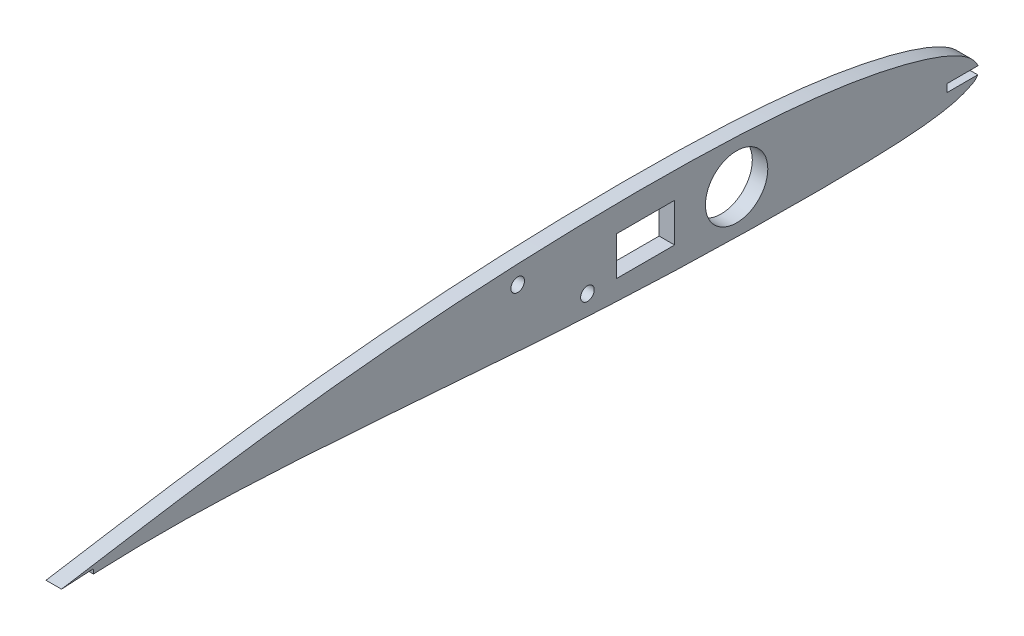
ISO-10303-21;
HEADER;
FILE_DESCRIPTION(('STEP AP214'),'2;1');
FILE_NAME('part.step','',(''),(''),'','','');
FILE_SCHEMA(('AUTOMOTIVE_DESIGN { 1 0 10303 214 1 1 1 1 }'));
ENDSEC;
DATA;
#1=APPLICATION_CONTEXT('core data for automotive mechanical design processes');
#2=APPLICATION_PROTOCOL_DEFINITION('international standard','automotive_design',2000,#1);
#3=PRODUCT_CONTEXT('',#1,'mechanical');
#4=PRODUCT('Part','Part','',(#3));
#5=PRODUCT_RELATED_PRODUCT_CATEGORY('part','',(#4));
#6=PRODUCT_DEFINITION_FORMATION('','',#4);
#7=PRODUCT_DEFINITION_CONTEXT('part definition',#1,'design');
#8=PRODUCT_DEFINITION('design','',#6,#7);
#9=PRODUCT_DEFINITION_SHAPE('','',#8);
#10=(LENGTH_UNIT() NAMED_UNIT(*) SI_UNIT(.MILLI.,.METRE.));
#11=(NAMED_UNIT(*) PLANE_ANGLE_UNIT() SI_UNIT($,.RADIAN.));
#12=(NAMED_UNIT(*) SI_UNIT($,.STERADIAN.) SOLID_ANGLE_UNIT());
#13=UNCERTAINTY_MEASURE_WITH_UNIT(LENGTH_MEASURE(1.E-05),#10,'distance_accuracy_value','');
#14=(GEOMETRIC_REPRESENTATION_CONTEXT(3) GLOBAL_UNCERTAINTY_ASSIGNED_CONTEXT((#13)) GLOBAL_UNIT_ASSIGNED_CONTEXT((#10,
#11,#12)) REPRESENTATION_CONTEXT('',''));
#15=CARTESIAN_POINT('',(0.,0.,0.));
#16=DIRECTION('',(0.,0.,1.));
#17=DIRECTION('',(1.,0.,0.));
#18=AXIS2_PLACEMENT_3D('',#15,#16,#17);
#19=CARTESIAN_POINT('',(4.,0.,250.));
#20=CARTESIAN_POINT('',(4.,-0.0080427959719715,250.000228293678));
#21=CARTESIAN_POINT('',(4.,0.172375657967406,248.284955515532));
#22=CARTESIAN_POINT('',(4.,0.308690014795419,246.518112419387));
#23=CARTESIAN_POINT('',(4.,0.685693593852336,242.189387343398));
#24=CARTESIAN_POINT('',(4.,1.07410152891603,236.806461263496));
#25=CARTESIAN_POINT('',(4.,1.49731723995003,229.680385951639));
#26=CARTESIAN_POINT('',(4.,1.8232186026768,221.18415869828));
#27=CARTESIAN_POINT('',(4.,1.96762610068065,211.337618207726));
#28=CARTESIAN_POINT('',(4.,1.83322105638369,200.371188527109));
#29=CARTESIAN_POINT('',(4.,1.38960528984164,188.499913622482));
#30=CARTESIAN_POINT('',(4.,0.706014078000893,175.953687417433));
#31=CARTESIAN_POINT('',(4.,-0.160208641561513,162.931424917666));
#32=CARTESIAN_POINT('',(4.,-1.14801632724376,149.615771743617));
#33=CARTESIAN_POINT('',(4.,-2.19092490983926,136.176354994724));
#34=CARTESIAN_POINT('',(4.,-3.21958397917046,122.767140548026));
#35=CARTESIAN_POINT('',(4.,-4.15274312671142,109.520053587455));
#36=CARTESIAN_POINT('',(4.,-4.93856436487493,96.5460959745437));
#37=CARTESIAN_POINT('',(4.,-5.53683070268675,83.9408193016427));
#38=CARTESIAN_POINT('',(4.,-5.94764820461108,71.8018392906514));
#39=CARTESIAN_POINT('',(4.,-6.21845093878312,60.2452560030716));
#40=CARTESIAN_POINT('',(4.,-6.35536975583973,49.3987328907547));
#41=CARTESIAN_POINT('',(4.,-6.38138796281789,39.3972261942655));
#42=CARTESIAN_POINT('',(4.,-6.26504923032313,30.3619348419668));
#43=CARTESIAN_POINT('',(4.,-6.01216491688521,22.4121811031587));
#44=CARTESIAN_POINT('',(4.,-5.59743390072595,15.6262272306516));
#45=CARTESIAN_POINT('',(4.,-4.92870657935606,10.0719075109048));
#46=CARTESIAN_POINT('',(4.,-4.04044698146404,5.69769261214423));
#47=CARTESIAN_POINT('',(4.,-2.8657529844069,2.62532063874475));
#48=CARTESIAN_POINT('',(4.,-1.7115284699546,0.494884225045661));
#49=CARTESIAN_POINT('',(4.,-0.410454230626488,-0.0213125491030087));
#50=CARTESIAN_POINT('',(4.,0.792659826704065,0.0311691995850224));
#51=CARTESIAN_POINT('',(4.,2.30568433693192,0.812599241892923));
#52=CARTESIAN_POINT('',(4.,4.23835242447377,2.72886351673443));
#53=CARTESIAN_POINT('',(4.,6.11817212106947,5.76990724125498));
#54=CARTESIAN_POINT('',(4.,7.91359420170391,9.88094280419771));
#55=CARTESIAN_POINT('',(4.,9.64131817838287,15.0749304677094));
#56=CARTESIAN_POINT('',(4.,11.2838964878058,21.2987522216172));
#57=CARTESIAN_POINT('',(4.,12.7883817585812,28.4971721202648));
#58=CARTESIAN_POINT('',(4.,14.0978349081275,36.6073734062479));
#59=CARTESIAN_POINT('',(4.,15.1594290171638,45.573028440303));
#60=CARTESIAN_POINT('',(4.,15.9609039979753,55.3329100744701));
#61=CARTESIAN_POINT('',(4.,16.4940697383882,65.8165364983871));
#62=CARTESIAN_POINT('',(4.,16.7919897051422,76.9313762604552));
#63=CARTESIAN_POINT('',(4.,16.864754130909,88.5669490281142));
#64=CARTESIAN_POINT('',(4.,16.7267152914356,100.596999885542));
#65=CARTESIAN_POINT('',(4.,16.3833850637257,112.888825982424));
#66=CARTESIAN_POINT('',(4.,15.825573666627,125.31161581915));
#67=CARTESIAN_POINT('',(4.,15.0523318700684,137.743791097076));
#68=CARTESIAN_POINT('',(4.,14.0593390742259,150.072384382085));
#69=CARTESIAN_POINT('',(4.,12.8815869860292,162.191375055682));
#70=CARTESIAN_POINT('',(4.,11.5492803460744,173.989074322246));
#71=CARTESIAN_POINT('',(4.,10.1162497290333,185.35236444642));
#72=CARTESIAN_POINT('',(4.,8.63237912523508,196.163081697706));
#73=CARTESIAN_POINT('',(4.,7.13151388385034,206.300441402258));
#74=CARTESIAN_POINT('',(4.,5.73122176805054,215.560350587015));
#75=CARTESIAN_POINT('',(4.,4.29329512716244,223.97715704258));
#76=CARTESIAN_POINT('',(4.,3.1818088737293,231.363413336396));
#77=CARTESIAN_POINT('',(4.,2.09894241729889,237.746440904332));
#78=CARTESIAN_POINT('',(4.,1.2458619166603,242.622069365861));
#79=CARTESIAN_POINT('',(4.,0.552864946230777,246.64452933247));
#80=CARTESIAN_POINT('',(4.,0.246216764640028,248.328398440367));
#81=CARTESIAN_POINT('',(4.,0.00797737724443801,249.999773563223));
#82=CARTESIAN_POINT('',(4.,0.,250.));
#83=B_SPLINE_CURVE_WITH_KNOTS('',3,(#19,#20,#21,#22,#23,#24,#25,#26,#27,#28,#29,#30,#31,#32,#33,
#34,#35,#36,#37,#38,#39,#40,#41,#42,#43,#44,#45,#46,#47,#48,#49,#50,#51,#52,#53,#54,#55,#56,#57,
#58,#59,#60,#61,#62,#63,#64,#65,#66,#67,#68,#69,#70,#71,#72,#73,#74,#75,#76,#77,#78,#79,#80,#81,
#82),.UNSPECIFIED.,.T.,.F.,(4,1,1,1,1,1,1,1,1,1,1,1,1,1,1,1,1,1,1,1,1,1,1,1,1,1,1,1,1,1,1,1,1,1,
1,1,1,1,1,1,1,1,1,1,1,1,1,1,1,1,1,1,1,1,1,1,1,1,1,1,1,4),(0.,0.00158888881614516,
0.00632921783555629,0.0142024564897436,0.0251728077530557,0.0391734833267743,0.0560606311759249,
0.0755789238487882,0.0973636066296903,0.120926258366677,0.145825281006277,0.171670911815127,
0.198108536705041,0.22479018357162,0.25139057978404,0.277643490654311,0.303326750051388,
0.328257458029316,0.352272548115194,0.375156061746876,0.396620664402003,0.416422729294005,
0.434304420097656,0.450054679859308,0.463465465082325,0.474478994238096,0.483169222153171,
0.489678354497499,0.494104066315722,0.496910015324886,0.497289784891853,0.501214273282496,
0.506457950332762,0.51335695674223,0.522168631834455,0.53296596992453,0.545689209241574,
0.56022077890382,0.57643892310517,0.594258689005965,0.613600244568652,0.634342385932902,
0.656331109263004,0.679351893859712,0.703152302846811,0.727478208080039,0.7520707394079,
0.776691163534608,0.801140183976245,0.825214386971546,0.848697423570622,0.871352857669295,
0.892947448931157,0.913230871058069,0.931955467148994,0.94834206907442,0.963693004275676,
0.976235918239566,0.986320058750392,0.993788799349345,0.998424034933867,1.),.UNSPECIFIED.);
#84=DIRECTION('',(-1.,0.,0.));
#85=VECTOR('',#84,1.);
#86=SURFACE_OF_LINEAR_EXTRUSION('',#83,#85);
#87=CARTESIAN_POINT('',(4.,1.5262200158208,228.477241363067));
#88=VERTEX_POINT('',#87);
#89=CARTESIAN_POINT('',(4.,-1.00000653516622,0.266538474913965));
#90=VERTEX_POINT('',#89);
#91=EDGE_CURVE('E60',#88,#90,#83,.T.);
#92=ORIENTED_EDGE('',*,*,#91,.F.);
#93=DIRECTION('',(-1.,0.,0.));
#94=VECTOR('',#93,1.);
#95=CARTESIAN_POINT('',(4.,1.5262200158208,228.477241363067));
#96=LINE('',#95,#94);
#97=CARTESIAN_POINT('',(0.,1.5262200158208,228.477241363067));
#98=VERTEX_POINT('',#97);
#99=EDGE_CURVE('E127',#88,#98,#96,.T.);
#100=ORIENTED_EDGE('',*,*,#99,.T.);
#101=CARTESIAN_POINT('',(0.,0.,250.));
#102=CARTESIAN_POINT('',(0.,-0.0080427959719715,250.000228293678));
#103=CARTESIAN_POINT('',(0.,0.172375657967406,248.284955515532));
#104=CARTESIAN_POINT('',(0.,0.308690014795419,246.518112419387));
#105=CARTESIAN_POINT('',(0.,0.685693593852336,242.189387343398));
#106=CARTESIAN_POINT('',(0.,1.07410152891603,236.806461263496));
#107=CARTESIAN_POINT('',(0.,1.49731723995003,229.680385951639));
#108=CARTESIAN_POINT('',(0.,1.8232186026768,221.18415869828));
#109=CARTESIAN_POINT('',(0.,1.96762610068065,211.337618207726));
#110=CARTESIAN_POINT('',(0.,1.83322105638369,200.371188527109));
#111=CARTESIAN_POINT('',(0.,1.38960528984164,188.499913622482));
#112=CARTESIAN_POINT('',(0.,0.706014078000893,175.953687417433));
#113=CARTESIAN_POINT('',(0.,-0.160208641561513,162.931424917666));
#114=CARTESIAN_POINT('',(0.,-1.14801632724376,149.615771743617));
#115=CARTESIAN_POINT('',(0.,-2.19092490983926,136.176354994724));
#116=CARTESIAN_POINT('',(0.,-3.21958397917046,122.767140548026));
#117=CARTESIAN_POINT('',(0.,-4.15274312671142,109.520053587455));
#118=CARTESIAN_POINT('',(0.,-4.93856436487493,96.5460959745437));
#119=CARTESIAN_POINT('',(0.,-5.53683070268675,83.9408193016427));
#120=CARTESIAN_POINT('',(0.,-5.94764820461108,71.8018392906514));
#121=CARTESIAN_POINT('',(0.,-6.21845093878312,60.2452560030716));
#122=CARTESIAN_POINT('',(0.,-6.35536975583973,49.3987328907547));
#123=CARTESIAN_POINT('',(0.,-6.38138796281789,39.3972261942655));
#124=CARTESIAN_POINT('',(0.,-6.26504923032313,30.3619348419668));
#125=CARTESIAN_POINT('',(0.,-6.01216491688521,22.4121811031587));
#126=CARTESIAN_POINT('',(0.,-5.59743390072595,15.6262272306516));
#127=CARTESIAN_POINT('',(0.,-4.92870657935606,10.0719075109048));
#128=CARTESIAN_POINT('',(0.,-4.04044698146404,5.69769261214423));
#129=CARTESIAN_POINT('',(0.,-2.8657529844069,2.62532063874475));
#130=CARTESIAN_POINT('',(0.,-1.7115284699546,0.494884225045661));
#131=CARTESIAN_POINT('',(0.,-0.410454230626488,-0.0213125491030087));
#132=CARTESIAN_POINT('',(0.,0.792659826704065,0.0311691995850224));
#133=CARTESIAN_POINT('',(0.,2.30568433693192,0.812599241892923));
#134=CARTESIAN_POINT('',(0.,4.23835242447377,2.72886351673443));
#135=CARTESIAN_POINT('',(0.,6.11817212106947,5.76990724125498));
#136=CARTESIAN_POINT('',(0.,7.91359420170391,9.88094280419771));
#137=CARTESIAN_POINT('',(0.,9.64131817838287,15.0749304677094));
#138=CARTESIAN_POINT('',(0.,11.2838964878058,21.2987522216172));
#139=CARTESIAN_POINT('',(0.,12.7883817585812,28.4971721202648));
#140=CARTESIAN_POINT('',(0.,14.0978349081275,36.6073734062479));
#141=CARTESIAN_POINT('',(0.,15.1594290171638,45.573028440303));
#142=CARTESIAN_POINT('',(0.,15.9609039979753,55.3329100744701));
#143=CARTESIAN_POINT('',(0.,16.4940697383882,65.8165364983871));
#144=CARTESIAN_POINT('',(0.,16.7919897051422,76.9313762604552));
#145=CARTESIAN_POINT('',(0.,16.864754130909,88.5669490281142));
#146=CARTESIAN_POINT('',(0.,16.7267152914356,100.596999885542));
#147=CARTESIAN_POINT('',(0.,16.3833850637257,112.888825982424));
#148=CARTESIAN_POINT('',(0.,15.825573666627,125.31161581915));
#149=CARTESIAN_POINT('',(0.,15.0523318700684,137.743791097076));
#150=CARTESIAN_POINT('',(0.,14.0593390742259,150.072384382085));
#151=CARTESIAN_POINT('',(0.,12.8815869860292,162.191375055682));
#152=CARTESIAN_POINT('',(0.,11.5492803460744,173.989074322246));
#153=CARTESIAN_POINT('',(0.,10.1162497290333,185.35236444642));
#154=CARTESIAN_POINT('',(0.,8.63237912523508,196.163081697706));
#155=CARTESIAN_POINT('',(0.,7.13151388385034,206.300441402258));
#156=CARTESIAN_POINT('',(0.,5.73122176805054,215.560350587015));
#157=CARTESIAN_POINT('',(0.,4.29329512716244,223.97715704258));
#158=CARTESIAN_POINT('',(0.,3.1818088737293,231.363413336396));
#159=CARTESIAN_POINT('',(0.,2.09894241729889,237.746440904332));
#160=CARTESIAN_POINT('',(0.,1.2458619166603,242.622069365861));
#161=CARTESIAN_POINT('',(0.,0.552864946230777,246.64452933247));
#162=CARTESIAN_POINT('',(0.,0.246216764640028,248.328398440367));
#163=CARTESIAN_POINT('',(0.,0.00797737724443801,249.999773563223));
#164=CARTESIAN_POINT('',(0.,0.,250.));
#165=B_SPLINE_CURVE_WITH_KNOTS('',3,(#101,#102,#103,#104,#105,#106,#107,#108,#109,#110,#111,
#112,#113,#114,#115,#116,#117,#118,#119,#120,#121,#122,#123,#124,#125,#126,#127,#128,#129,#130,
#131,#132,#133,#134,#135,#136,#137,#138,#139,#140,#141,#142,#143,#144,#145,#146,#147,#148,#149,
#150,#151,#152,#153,#154,#155,#156,#157,#158,#159,#160,#161,#162,#163,#164),.UNSPECIFIED.,.T.,
.F.,(4,1,1,1,1,1,1,1,1,1,1,1,1,1,1,1,1,1,1,1,1,1,1,1,1,1,1,1,1,1,1,1,1,1,1,1,1,1,1,1,1,1,1,1,1,
1,1,1,1,1,1,1,1,1,1,1,1,1,1,1,1,4),(0.,0.00158888881614516,0.00632921783555629,
0.0142024564897436,0.0251728077530557,0.0391734833267743,0.0560606311759249,0.0755789238487882,
0.0973636066296903,0.120926258366677,0.145825281006277,0.171670911815127,0.198108536705041,
0.22479018357162,0.25139057978404,0.277643490654311,0.303326750051388,0.328257458029316,
0.352272548115194,0.375156061746876,0.396620664402003,0.416422729294005,0.434304420097656,
0.450054679859308,0.463465465082325,0.474478994238096,0.483169222153171,0.489678354497499,
0.494104066315722,0.496910015324886,0.497289784891853,0.501214273282496,0.506457950332762,
0.51335695674223,0.522168631834455,0.53296596992453,0.545689209241574,0.56022077890382,
0.57643892310517,0.594258689005965,0.613600244568652,0.634342385932902,0.656331109263004,
0.679351893859712,0.703152302846811,0.727478208080039,0.7520707394079,0.776691163534608,
0.801140183976245,0.825214386971546,0.848697423570622,0.871352857669295,0.892947448931157,
0.913230871058069,0.931955467148994,0.94834206907442,0.963693004275676,0.976235918239566,
0.986320058750392,0.993788799349345,0.998424034933867,1.),.UNSPECIFIED.);
#166=CARTESIAN_POINT('',(0.,-1.00000652295607,0.266538474914019));
#167=VERTEX_POINT('',#166);
#168=EDGE_CURVE('E38',#98,#167,#165,.T.);
#169=ORIENTED_EDGE('',*,*,#168,.T.);
#170=DIRECTION('',(-1.,0.,0.));
#171=VECTOR('',#170,1.);
#172=CARTESIAN_POINT('',(4.,-1.00000652295608,0.26653846850589));
#173=LINE('',#172,#171);
#174=EDGE_CURVE('E44',#167,#90,#173,.F.);
#175=ORIENTED_EDGE('',*,*,#174,.T.);
#176=EDGE_LOOP('',(#92,#100,#169,#175));
#177=FACE_BOUND('',#176,.T.);
#178=ADVANCED_FACE('F33',(#177),#86,.F.);
#179=CARTESIAN_POINT('',(4.,1.49711132773622,0.435092083404368));
#180=DIRECTION('',(-1.,0.,0.));
#181=DIRECTION('',(0.,0.,1.));
#182=AXIS2_PLACEMENT_3D('',#179,#180,#181);
#183=PLANE('',#182);
#184=CARTESIAN_POINT('',(4.,0.464299725262568,100.999919709394));
#185=DIRECTION('',(-1.,0.,0.));
#186=DIRECTION('',(0.,0.,1.));
#187=AXIS2_PLACEMENT_3D('',#184,#185,#186);
#188=CIRCLE('',#187,1.75);
#189=CARTESIAN_POINT('',(4.,0.464299725262568,102.749919709394));
#190=VERTEX_POINT('',#189);
#191=EDGE_CURVE('E148',#190,#190,#188,.T.);
#192=ORIENTED_EDGE('',*,*,#191,.T.);
#193=EDGE_LOOP('',(#192));
#194=FACE_BOUND('',#193,.T.);
#195=CARTESIAN_POINT('',(4.,11.4642997252626,118.999919709394));
#196=DIRECTION('',(-1.,0.,0.));
#197=DIRECTION('',(0.,0.,1.));
#198=AXIS2_PLACEMENT_3D('',#195,#196,#197);
#199=CIRCLE('',#198,1.75);
#200=CARTESIAN_POINT('',(4.,11.4642997252626,120.749919709394));
#201=VERTEX_POINT('',#200);
#202=EDGE_CURVE('E155',#201,#201,#199,.T.);
#203=ORIENTED_EDGE('',*,*,#202,.T.);
#204=EDGE_LOOP('',(#203));
#205=FACE_BOUND('',#204,.T.);
#206=CARTESIAN_POINT('',(4.,5.07732270373844,62.4999197093942));
#207=DIRECTION('',(1.,0.,0.));
#208=DIRECTION('',(0.,0.,-1.));
#209=AXIS2_PLACEMENT_3D('',#206,#207,#208);
#210=CIRCLE('',#209,8.05);
#211=CARTESIAN_POINT('',(4.,5.07732270373844,54.4499197093942));
#212=VERTEX_POINT('',#211);
#213=EDGE_CURVE('E210',#212,#212,#210,.T.);
#214=ORIENTED_EDGE('',*,*,#213,.F.);
#215=EDGE_LOOP('',(#214));
#216=FACE_BOUND('',#215,.T.);
#217=DIRECTION('',(0.,0.0556361766390646,-0.998451108391887));
#218=VECTOR('',#217,1.);
#219=CARTESIAN_POINT('',(4.,15.4115483761136,0.858769769023486));
#220=LINE('',#219,#218);
#221=CARTESIAN_POINT('',(4.,2.26814469716613,236.731303851277));
#222=VERTEX_POINT('',#221);
#223=CARTESIAN_POINT('',(4.,2.72436134676986,228.544004755659));
#224=VERTEX_POINT('',#223);
#225=EDGE_CURVE('E52',#222,#224,#220,.T.);
#226=ORIENTED_EDGE('',*,*,#225,.T.);
#227=DIRECTION('',(0.,-0.998451108391887,-0.0556361766390623));
#228=VECTOR('',#227,1.);
#229=CARTESIAN_POINT('',(4.,-12.6871870293432,227.685234986636));
#230=LINE('',#229,#228);
#231=EDGE_CURVE('E130',#224,#88,#230,.T.);
#232=ORIENTED_EDGE('',*,*,#231,.T.);
#233=ORIENTED_EDGE('',*,*,#91,.T.);
#234=DIRECTION('',(0.,0.,1.));
#235=VECTOR('',#234,1.);
#236=CARTESIAN_POINT('',(4.,-1.00000652295607,-8.02951190162347E-05));
#237=LINE('',#236,#235);
#238=CARTESIAN_POINT('',(4.,-1.00000652295607,8.19991970488098));
#239=VERTEX_POINT('',#238);
#240=EDGE_CURVE('E160',#90,#239,#237,.T.);
#241=ORIENTED_EDGE('',*,*,#240,.T.);
#242=DIRECTION('',(0.,1.,0.));
#243=VECTOR('',#242,1.);
#244=CARTESIAN_POINT('',(4.,0.999993477043933,8.19991970488098));
#245=LINE('',#244,#243);
#246=CARTESIAN_POINT('',(4.,0.999993477043933,8.19991970488098));
#247=VERTEX_POINT('',#246);
#248=EDGE_CURVE('E162',#239,#247,#245,.T.);
#249=ORIENTED_EDGE('',*,*,#248,.T.);
#250=DIRECTION('',(0.,0.,-1.));
#251=VECTOR('',#250,1.);
#252=CARTESIAN_POINT('',(4.,0.999993477043928,-8.0295119016847E-05));
#253=LINE('',#252,#251);
#254=CARTESIAN_POINT('',(4.,0.999993477043928,0.201514144687533));
#255=VERTEX_POINT('',#254);
#256=EDGE_CURVE('E166',#247,#255,#253,.T.);
#257=ORIENTED_EDGE('',*,*,#256,.T.);
#258=EDGE_CURVE('E139',#255,#222,#83,.T.);
#259=ORIENTED_EDGE('',*,*,#258,.T.);
#260=EDGE_LOOP('',(#226,#232,#233,#241,#249,#257,#259));
#261=FACE_BOUND('',#260,.T.);
#262=DIRECTION('',(0.,1.,0.));
#263=VECTOR('',#262,1.);
#264=CARTESIAN_POINT('',(4.,10.0773227037384,78.4999197093942));
#265=LINE('',#264,#263);
#266=CARTESIAN_POINT('',(4.,0.0773227037384437,78.4999197093942));
#267=VERTEX_POINT('',#266);
#268=CARTESIAN_POINT('',(4.,10.0773227037384,78.4999197093942));
#269=VERTEX_POINT('',#268);
#270=EDGE_CURVE('E179',#267,#269,#265,.T.);
#271=ORIENTED_EDGE('',*,*,#270,.F.);
#272=DIRECTION('',(0.,0.,-1.));
#273=VECTOR('',#272,1.);
#274=CARTESIAN_POINT('',(4.,0.0773227037384437,78.4999197093942));
#275=LINE('',#274,#273);
#276=CARTESIAN_POINT('',(4.,0.0773227037384437,93.4999197093942));
#277=VERTEX_POINT('',#276);
#278=EDGE_CURVE('E187',#277,#267,#275,.T.);
#279=ORIENTED_EDGE('',*,*,#278,.F.);
#280=DIRECTION('',(0.,-1.,0.));
#281=VECTOR('',#280,1.);
#282=CARTESIAN_POINT('',(4.,10.0773227037384,93.4999197093942));
#283=LINE('',#282,#281);
#284=CARTESIAN_POINT('',(4.,10.0773227037384,93.4999197093942));
#285=VERTEX_POINT('',#284);
#286=EDGE_CURVE('E184',#285,#277,#283,.T.);
#287=ORIENTED_EDGE('',*,*,#286,.F.);
#288=DIRECTION('',(0.,0.,1.));
#289=VECTOR('',#288,1.);
#290=CARTESIAN_POINT('',(4.,10.0773227037384,78.4999197093942));
#291=LINE('',#290,#289);
#292=EDGE_CURVE('E181',#269,#285,#291,.T.);
#293=ORIENTED_EDGE('',*,*,#292,.F.);
#294=EDGE_LOOP('',(#271,#279,#287,#293));
#295=FACE_BOUND('',#294,.T.);
#296=ADVANCED_FACE('F135',(#194,#205,#216,#261,#295),#183,.F.);
#297=CARTESIAN_POINT('',(0.,1.49711132773622,0.435092083404368));
#298=DIRECTION('',(-1.,0.,0.));
#299=DIRECTION('',(0.,0.,1.));
#300=AXIS2_PLACEMENT_3D('',#297,#298,#299);
#301=PLANE('',#300);
#302=DIRECTION('',(0.,-0.998451108391887,-0.0556361766390623));
#303=VECTOR('',#302,1.);
#304=CARTESIAN_POINT('',(0.,-12.6871870293432,227.685234986636));
#305=LINE('',#304,#303);
#306=CARTESIAN_POINT('',(0.,2.72436134676986,228.544004755659));
#307=VERTEX_POINT('',#306);
#308=EDGE_CURVE('E140',#307,#98,#305,.T.);
#309=ORIENTED_EDGE('',*,*,#308,.F.);
#310=DIRECTION('',(0.,0.0556361766390646,-0.998451108391887));
#311=VECTOR('',#310,1.);
#312=CARTESIAN_POINT('',(0.,15.4115483761136,0.858769769023486));
#313=LINE('',#312,#311);
#314=CARTESIAN_POINT('',(0.,2.26814469716616,236.731303851277));
#315=VERTEX_POINT('',#314);
#316=EDGE_CURVE('E124',#315,#307,#313,.T.);
#317=ORIENTED_EDGE('',*,*,#316,.F.);
#318=CARTESIAN_POINT('',(0.,0.999993477043928,0.201514144687533));
#319=VERTEX_POINT('',#318);
#320=EDGE_CURVE('E217',#319,#315,#165,.T.);
#321=ORIENTED_EDGE('',*,*,#320,.F.);
#322=DIRECTION('',(0.,0.,-1.));
#323=VECTOR('',#322,1.);
#324=CARTESIAN_POINT('',(0.,0.999993477043928,-8.0295119016847E-05));
#325=LINE('',#324,#323);
#326=CARTESIAN_POINT('',(0.,0.999993477043933,8.19991970488098));
#327=VERTEX_POINT('',#326);
#328=EDGE_CURVE('E163',#327,#319,#325,.T.);
#329=ORIENTED_EDGE('',*,*,#328,.F.);
#330=DIRECTION('',(0.,1.,0.));
#331=VECTOR('',#330,1.);
#332=CARTESIAN_POINT('',(0.,0.999993477043933,8.19991970488098));
#333=LINE('',#332,#331);
#334=CARTESIAN_POINT('',(0.,-1.00000652295607,8.19991970488098));
#335=VERTEX_POINT('',#334);
#336=EDGE_CURVE('E170',#335,#327,#333,.T.);
#337=ORIENTED_EDGE('',*,*,#336,.F.);
#338=DIRECTION('',(0.,0.,1.));
#339=VECTOR('',#338,1.);
#340=CARTESIAN_POINT('',(0.,-1.00000652295607,-8.02951190162347E-05));
#341=LINE('',#340,#339);
#342=EDGE_CURVE('E151',#167,#335,#341,.T.);
#343=ORIENTED_EDGE('',*,*,#342,.F.);
#344=ORIENTED_EDGE('',*,*,#168,.F.);
#345=EDGE_LOOP('',(#309,#317,#321,#329,#337,#343,#344));
#346=FACE_BOUND('',#345,.T.);
#347=CARTESIAN_POINT('',(0.,0.464299725262568,100.999919709394));
#348=DIRECTION('',(-1.,0.,0.));
#349=DIRECTION('',(0.,0.,1.));
#350=AXIS2_PLACEMENT_3D('',#347,#348,#349);
#351=CIRCLE('',#350,1.75);
#352=CARTESIAN_POINT('',(0.,0.464299725262568,102.749919709394));
#353=VERTEX_POINT('',#352);
#354=EDGE_CURVE('E152',#353,#353,#351,.T.);
#355=ORIENTED_EDGE('',*,*,#354,.F.);
#356=EDGE_LOOP('',(#355));
#357=FACE_BOUND('',#356,.T.);
#358=CARTESIAN_POINT('',(0.,11.4642997252626,118.999919709394));
#359=DIRECTION('',(-1.,0.,0.));
#360=DIRECTION('',(0.,0.,1.));
#361=AXIS2_PLACEMENT_3D('',#358,#359,#360);
#362=CIRCLE('',#361,1.75);
#363=CARTESIAN_POINT('',(0.,11.4642997252626,120.749919709394));
#364=VERTEX_POINT('',#363);
#365=EDGE_CURVE('E145',#364,#364,#362,.T.);
#366=ORIENTED_EDGE('',*,*,#365,.F.);
#367=EDGE_LOOP('',(#366));
#368=FACE_BOUND('',#367,.T.);
#369=CARTESIAN_POINT('',(0.,5.07732270373844,62.4999197093942));
#370=DIRECTION('',(1.,0.,0.));
#371=DIRECTION('',(0.,0.,-1.));
#372=AXIS2_PLACEMENT_3D('',#369,#370,#371);
#373=CIRCLE('',#372,8.05);
#374=CARTESIAN_POINT('',(0.,5.07732270373844,54.4499197093942));
#375=VERTEX_POINT('',#374);
#376=EDGE_CURVE('E209',#375,#375,#373,.T.);
#377=ORIENTED_EDGE('',*,*,#376,.T.);
#378=EDGE_LOOP('',(#377));
#379=FACE_BOUND('',#378,.T.);
#380=DIRECTION('',(0.,0.,-1.));
#381=VECTOR('',#380,1.);
#382=CARTESIAN_POINT('',(0.,0.0773227037384437,78.4999197093942));
#383=LINE('',#382,#381);
#384=CARTESIAN_POINT('',(0.,0.0773227037384437,93.4999197093942));
#385=VERTEX_POINT('',#384);
#386=CARTESIAN_POINT('',(0.,0.0773227037384437,78.4999197093942));
#387=VERTEX_POINT('',#386);
#388=EDGE_CURVE('E182',#385,#387,#383,.T.);
#389=ORIENTED_EDGE('',*,*,#388,.T.);
#390=DIRECTION('',(0.,1.,0.));
#391=VECTOR('',#390,1.);
#392=CARTESIAN_POINT('',(0.,10.0773227037384,78.4999197093942));
#393=LINE('',#392,#391);
#394=CARTESIAN_POINT('',(0.,10.0773227037384,78.4999197093942));
#395=VERTEX_POINT('',#394);
#396=EDGE_CURVE('E176',#387,#395,#393,.T.);
#397=ORIENTED_EDGE('',*,*,#396,.T.);
#398=DIRECTION('',(0.,0.,1.));
#399=VECTOR('',#398,1.);
#400=CARTESIAN_POINT('',(0.,10.0773227037384,78.4999197093942));
#401=LINE('',#400,#399);
#402=CARTESIAN_POINT('',(0.,10.0773227037384,93.4999197093942));
#403=VERTEX_POINT('',#402);
#404=EDGE_CURVE('E192',#395,#403,#401,.T.);
#405=ORIENTED_EDGE('',*,*,#404,.T.);
#406=DIRECTION('',(0.,-1.,0.));
#407=VECTOR('',#406,1.);
#408=CARTESIAN_POINT('',(0.,10.0773227037384,93.4999197093942));
#409=LINE('',#408,#407);
#410=EDGE_CURVE('E195',#403,#385,#409,.T.);
#411=ORIENTED_EDGE('',*,*,#410,.T.);
#412=EDGE_LOOP('',(#389,#397,#405,#411));
#413=FACE_BOUND('',#412,.T.);
#414=ADVANCED_FACE('F235',(#346,#357,#368,#379,#413),#301,.T.);
#415=ORIENTED_EDGE('',*,*,#320,.T.);
#416=DIRECTION('',(-1.,0.,0.));
#417=VECTOR('',#416,1.);
#418=CARTESIAN_POINT('',(4.,2.26814469716616,236.731303851277));
#419=LINE('',#418,#417);
#420=EDGE_CURVE('E128',#222,#315,#419,.T.);
#421=ORIENTED_EDGE('',*,*,#420,.F.);
#422=ORIENTED_EDGE('',*,*,#258,.F.);
#423=DIRECTION('',(-1.,0.,0.));
#424=VECTOR('',#423,1.);
#425=CARTESIAN_POINT('',(4.,0.999993477043937,0.201514159716749));
#426=LINE('',#425,#424);
#427=EDGE_CURVE('E11',#255,#319,#426,.T.);
#428=ORIENTED_EDGE('',*,*,#427,.T.);
#429=EDGE_LOOP('',(#415,#421,#422,#428));
#430=FACE_BOUND('',#429,.T.);
#431=ADVANCED_FACE('F35',(#430),#86,.F.);
#432=CARTESIAN_POINT('',(4.,5.07732270373844,62.4999197093942));
#433=DIRECTION('',(-1.,0.,0.));
#434=DIRECTION('',(0.,0.,1.));
#435=AXIS2_PLACEMENT_3D('',#432,#433,#434);
#436=CYLINDRICAL_SURFACE('',#435,8.05);
#437=ORIENTED_EDGE('',*,*,#213,.T.);
#438=EDGE_LOOP('',(#437));
#439=FACE_BOUND('',#438,.T.);
#440=ORIENTED_EDGE('',*,*,#376,.F.);
#441=EDGE_LOOP('',(#440));
#442=FACE_BOUND('',#441,.T.);
#443=ADVANCED_FACE('F267',(#439,#442),#436,.F.);
#444=CARTESIAN_POINT('',(4.,10.0773227037384,78.4999197093942));
#445=DIRECTION('',(0.,0.,1.));
#446=DIRECTION('',(1.,0.,0.));
#447=AXIS2_PLACEMENT_3D('',#444,#445,#446);
#448=PLANE('',#447);
#449=ORIENTED_EDGE('',*,*,#396,.F.);
#450=DIRECTION('',(-1.,0.,0.));
#451=VECTOR('',#450,1.);
#452=CARTESIAN_POINT('',(4.,0.0773227037384437,78.4999197093942));
#453=LINE('',#452,#451);
#454=EDGE_CURVE('E189',#267,#387,#453,.T.);
#455=ORIENTED_EDGE('',*,*,#454,.F.);
#456=ORIENTED_EDGE('',*,*,#270,.T.);
#457=DIRECTION('',(-1.,0.,0.));
#458=VECTOR('',#457,1.);
#459=CARTESIAN_POINT('',(4.,10.0773227037384,78.4999197093942));
#460=LINE('',#459,#458);
#461=EDGE_CURVE('E206',#269,#395,#460,.T.);
#462=ORIENTED_EDGE('',*,*,#461,.T.);
#463=EDGE_LOOP('',(#449,#455,#456,#462));
#464=FACE_BOUND('',#463,.T.);
#465=ADVANCED_FACE('F272',(#464),#448,.T.);
#466=CARTESIAN_POINT('',(4.,10.0773227037384,78.4999197093942));
#467=DIRECTION('',(0.,-1.,0.));
#468=DIRECTION('',(0.,0.,-1.));
#469=AXIS2_PLACEMENT_3D('',#466,#467,#468);
#470=PLANE('',#469);
#471=ORIENTED_EDGE('',*,*,#404,.F.);
#472=ORIENTED_EDGE('',*,*,#461,.F.);
#473=ORIENTED_EDGE('',*,*,#292,.T.);
#474=DIRECTION('',(-1.,0.,0.));
#475=VECTOR('',#474,1.);
#476=CARTESIAN_POINT('',(4.,10.0773227037384,93.4999197093942));
#477=LINE('',#476,#475);
#478=EDGE_CURVE('E204',#285,#403,#477,.T.);
#479=ORIENTED_EDGE('',*,*,#478,.T.);
#480=EDGE_LOOP('',(#471,#472,#473,#479));
#481=FACE_BOUND('',#480,.T.);
#482=ADVANCED_FACE('F280',(#481),#470,.T.);
#483=CARTESIAN_POINT('',(4.,10.0773227037384,93.4999197093942));
#484=DIRECTION('',(0.,0.,-1.));
#485=DIRECTION('',(-1.,0.,0.));
#486=AXIS2_PLACEMENT_3D('',#483,#484,#485);
#487=PLANE('',#486);
#488=ORIENTED_EDGE('',*,*,#410,.F.);
#489=ORIENTED_EDGE('',*,*,#478,.F.);
#490=ORIENTED_EDGE('',*,*,#286,.T.);
#491=DIRECTION('',(-1.,0.,0.));
#492=VECTOR('',#491,1.);
#493=CARTESIAN_POINT('',(4.,0.0773227037384437,93.4999197093942));
#494=LINE('',#493,#492);
#495=EDGE_CURVE('E202',#277,#385,#494,.T.);
#496=ORIENTED_EDGE('',*,*,#495,.T.);
#497=EDGE_LOOP('',(#488,#489,#490,#496));
#498=FACE_BOUND('',#497,.T.);
#499=ADVANCED_FACE('F255',(#498),#487,.T.);
#500=CARTESIAN_POINT('',(4.,0.0773227037384437,78.4999197093942));
#501=DIRECTION('',(0.,1.,0.));
#502=DIRECTION('',(0.,0.,1.));
#503=AXIS2_PLACEMENT_3D('',#500,#501,#502);
#504=PLANE('',#503);
#505=ORIENTED_EDGE('',*,*,#388,.F.);
#506=ORIENTED_EDGE('',*,*,#495,.F.);
#507=ORIENTED_EDGE('',*,*,#278,.T.);
#508=ORIENTED_EDGE('',*,*,#454,.T.);
#509=EDGE_LOOP('',(#505,#506,#507,#508));
#510=FACE_BOUND('',#509,.T.);
#511=ADVANCED_FACE('F248',(#510),#504,.T.);
#512=CARTESIAN_POINT('',(4.,0.999993477043928,-8.0295119016847E-05));
#513=DIRECTION('',(0.,1.,0.));
#514=DIRECTION('',(0.,0.,1.));
#515=AXIS2_PLACEMENT_3D('',#512,#513,#514);
#516=PLANE('',#515);
#517=ORIENTED_EDGE('',*,*,#256,.F.);
#518=DIRECTION('',(-1.,0.,0.));
#519=VECTOR('',#518,1.);
#520=CARTESIAN_POINT('',(4.,0.999993477043933,8.19991970488098));
#521=LINE('',#520,#519);
#522=EDGE_CURVE('E174',#247,#327,#521,.T.);
#523=ORIENTED_EDGE('',*,*,#522,.T.);
#524=ORIENTED_EDGE('',*,*,#328,.T.);
#525=ORIENTED_EDGE('',*,*,#427,.F.);
#526=EDGE_LOOP('',(#517,#523,#524,#525));
#527=FACE_BOUND('',#526,.T.);
#528=ADVANCED_FACE('F246',(#527),#516,.F.);
#529=CARTESIAN_POINT('',(4.,-1.00000652295607,-8.02951190162347E-05));
#530=DIRECTION('',(0.,-1.,0.));
#531=DIRECTION('',(0.,0.,-1.));
#532=AXIS2_PLACEMENT_3D('',#529,#530,#531);
#533=PLANE('',#532);
#534=ORIENTED_EDGE('',*,*,#342,.T.);
#535=DIRECTION('',(-1.,0.,0.));
#536=VECTOR('',#535,1.);
#537=CARTESIAN_POINT('',(4.,-1.00000652295607,8.19991970488098));
#538=LINE('',#537,#536);
#539=EDGE_CURVE('E168',#239,#335,#538,.T.);
#540=ORIENTED_EDGE('',*,*,#539,.F.);
#541=ORIENTED_EDGE('',*,*,#240,.F.);
#542=ORIENTED_EDGE('',*,*,#174,.F.);
#543=EDGE_LOOP('',(#534,#540,#541,#542));
#544=FACE_BOUND('',#543,.T.);
#545=ADVANCED_FACE('F232',(#544),#533,.F.);
#546=CARTESIAN_POINT('',(4.,0.999993477043933,8.19991970488098));
#547=DIRECTION('',(0.,0.,1.));
#548=DIRECTION('',(1.,0.,0.));
#549=AXIS2_PLACEMENT_3D('',#546,#547,#548);
#550=PLANE('',#549);
#551=ORIENTED_EDGE('',*,*,#336,.T.);
#552=ORIENTED_EDGE('',*,*,#522,.F.);
#553=ORIENTED_EDGE('',*,*,#248,.F.);
#554=ORIENTED_EDGE('',*,*,#539,.T.);
#555=EDGE_LOOP('',(#551,#552,#553,#554));
#556=FACE_BOUND('',#555,.T.);
#557=ADVANCED_FACE('F240',(#556),#550,.F.);
#558=CARTESIAN_POINT('',(4.,11.4642997252626,118.999919709394));
#559=DIRECTION('',(-1.,0.,0.));
#560=DIRECTION('',(0.,0.,1.));
#561=AXIS2_PLACEMENT_3D('',#558,#559,#560);
#562=CYLINDRICAL_SURFACE('',#561,1.75);
#563=ORIENTED_EDGE('',*,*,#202,.F.);
#564=EDGE_LOOP('',(#563));
#565=FACE_BOUND('',#564,.T.);
#566=ORIENTED_EDGE('',*,*,#365,.T.);
#567=EDGE_LOOP('',(#566));
#568=FACE_BOUND('',#567,.T.);
#569=ADVANCED_FACE('F288',(#565,#568),#562,.F.);
#570=CARTESIAN_POINT('',(4.,0.464299725262568,100.999919709394));
#571=DIRECTION('',(-1.,0.,0.));
#572=DIRECTION('',(0.,0.,1.));
#573=AXIS2_PLACEMENT_3D('',#570,#571,#572);
#574=CYLINDRICAL_SURFACE('',#573,1.75);
#575=ORIENTED_EDGE('',*,*,#191,.F.);
#576=EDGE_LOOP('',(#575));
#577=FACE_BOUND('',#576,.T.);
#578=ORIENTED_EDGE('',*,*,#354,.T.);
#579=EDGE_LOOP('',(#578));
#580=FACE_BOUND('',#579,.T.);
#581=ADVANCED_FACE('F292',(#577,#580),#574,.F.);
#582=CARTESIAN_POINT('',(4.,-12.6871870293432,227.685234986636));
#583=DIRECTION('',(0.,0.0556361766390623,-0.998451108391887));
#584=DIRECTION('',(0.,0.998451108391887,0.0556361766390623));
#585=AXIS2_PLACEMENT_3D('',#582,#583,#584);
#586=PLANE('',#585);
#587=ORIENTED_EDGE('',*,*,#308,.T.);
#588=ORIENTED_EDGE('',*,*,#99,.F.);
#589=ORIENTED_EDGE('',*,*,#231,.F.);
#590=DIRECTION('',(-1.,0.,0.));
#591=VECTOR('',#590,1.);
#592=CARTESIAN_POINT('',(4.,2.72436134676986,228.544004755659));
#593=LINE('',#592,#591);
#594=EDGE_CURVE('E120',#224,#307,#593,.T.);
#595=ORIENTED_EDGE('',*,*,#594,.T.);
#596=EDGE_LOOP('',(#587,#588,#589,#595));
#597=FACE_BOUND('',#596,.T.);
#598=ADVANCED_FACE('F131',(#597),#586,.F.);
#599=CARTESIAN_POINT('',(4.,15.4115483761136,0.858769769023486));
#600=DIRECTION('',(0.,0.998451108391887,0.0556361766390646));
#601=DIRECTION('',(0.,-0.0556361766390646,0.998451108391887));
#602=AXIS2_PLACEMENT_3D('',#599,#600,#601);
#603=PLANE('',#602);
#604=ORIENTED_EDGE('',*,*,#316,.T.);
#605=ORIENTED_EDGE('',*,*,#594,.F.);
#606=ORIENTED_EDGE('',*,*,#225,.F.);
#607=ORIENTED_EDGE('',*,*,#420,.T.);
#608=EDGE_LOOP('',(#604,#605,#606,#607));
#609=FACE_BOUND('',#608,.T.);
#610=ADVANCED_FACE('F122',(#609),#603,.F.);
#611=CLOSED_SHELL('',(#178,#296,#414,#431,#443,#465,#482,#499,#511,#528,#545,#557,#569,#581,
#598,#610));
#612=MANIFOLD_SOLID_BREP('B2',#611);
#613=ADVANCED_BREP_SHAPE_REPRESENTATION('',(#18,#612),#14);
#614=SHAPE_DEFINITION_REPRESENTATION(#9,#613);
ENDSEC;
END-ISO-10303-21;
